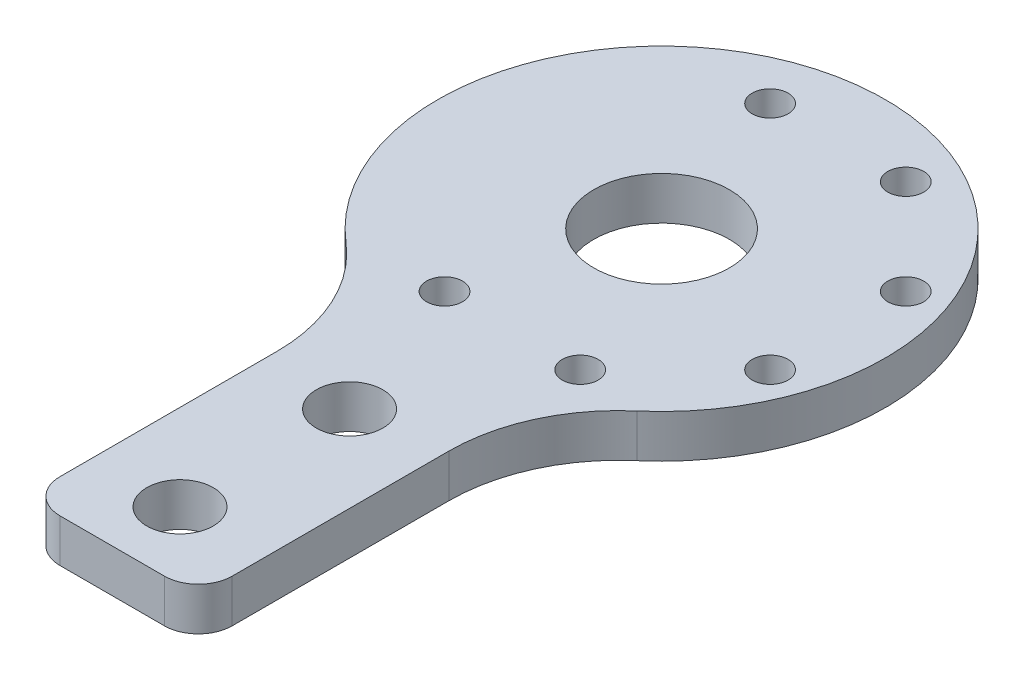
ISO-10303-21;
HEADER;
FILE_DESCRIPTION(('STEP AP214'),'2;1');
FILE_NAME('part.step','',(''),(''),'','','');
FILE_SCHEMA(('AUTOMOTIVE_DESIGN { 1 0 10303 214 1 1 1 1 }'));
ENDSEC;
DATA;
#1=APPLICATION_CONTEXT('core data for automotive mechanical design processes');
#2=APPLICATION_PROTOCOL_DEFINITION('international standard','automotive_design',2000,#1);
#3=PRODUCT_CONTEXT('',#1,'mechanical');
#4=PRODUCT('Part','Part','',(#3));
#5=PRODUCT_RELATED_PRODUCT_CATEGORY('part','',(#4));
#6=PRODUCT_DEFINITION_FORMATION('','',#4);
#7=PRODUCT_DEFINITION_CONTEXT('part definition',#1,'design');
#8=PRODUCT_DEFINITION('design','',#6,#7);
#9=PRODUCT_DEFINITION_SHAPE('','',#8);
#10=(LENGTH_UNIT() NAMED_UNIT(*) SI_UNIT(.MILLI.,.METRE.));
#11=(NAMED_UNIT(*) PLANE_ANGLE_UNIT() SI_UNIT($,.RADIAN.));
#12=(NAMED_UNIT(*) SI_UNIT($,.STERADIAN.) SOLID_ANGLE_UNIT());
#13=UNCERTAINTY_MEASURE_WITH_UNIT(LENGTH_MEASURE(1.E-05),#10,'distance_accuracy_value','');
#14=(GEOMETRIC_REPRESENTATION_CONTEXT(3) GLOBAL_UNCERTAINTY_ASSIGNED_CONTEXT((#13)) GLOBAL_UNIT_ASSIGNED_CONTEXT((#10,
#11,#12)) REPRESENTATION_CONTEXT('',''));
#15=CARTESIAN_POINT('',(0.,0.,0.));
#16=DIRECTION('',(0.,0.,1.));
#17=DIRECTION('',(1.,0.,0.));
#18=AXIS2_PLACEMENT_3D('',#15,#16,#17);
#19=CARTESIAN_POINT('',(12.7,6.35,81.));
#20=DIRECTION('',(-1.,0.,0.));
#21=DIRECTION('',(0.,0.,1.));
#22=AXIS2_PLACEMENT_3D('',#19,#20,#21);
#23=PLANE('',#22);
#24=DIRECTION('',(0.,0.,-1.));
#25=VECTOR('',#24,1.);
#26=CARTESIAN_POINT('',(12.7,6.35,81.));
#27=LINE('',#26,#25);
#28=CARTESIAN_POINT('',(12.7,6.35,76.));
#29=VERTEX_POINT('',#28);
#30=CARTESIAN_POINT('',(12.7,6.35,44.0761840453549));
#31=VERTEX_POINT('',#30);
#32=EDGE_CURVE('E227',#29,#31,#27,.T.);
#33=ORIENTED_EDGE('',*,*,#32,.F.);
#34=DIRECTION('',(0.,-1.,0.));
#35=VECTOR('',#34,1.);
#36=CARTESIAN_POINT('',(12.7,6.35,76.));
#37=LINE('',#36,#35);
#38=CARTESIAN_POINT('',(12.7,0.,76.));
#39=VERTEX_POINT('',#38);
#40=EDGE_CURVE('E11',#29,#39,#37,.T.);
#41=ORIENTED_EDGE('',*,*,#40,.T.);
#42=DIRECTION('',(0.,0.,-1.));
#43=VECTOR('',#42,1.);
#44=CARTESIAN_POINT('',(12.7,0.,81.));
#45=LINE('',#44,#43);
#46=CARTESIAN_POINT('',(12.7,0.,44.0761840453549));
#47=VERTEX_POINT('',#46);
#48=EDGE_CURVE('E236',#39,#47,#45,.T.);
#49=ORIENTED_EDGE('',*,*,#48,.T.);
#50=DIRECTION('',(0.,1.,0.));
#51=VECTOR('',#50,1.);
#52=CARTESIAN_POINT('',(12.7,6.35,44.0761840453549));
#53=LINE('',#52,#51);
#54=EDGE_CURVE('E131',#47,#31,#53,.T.);
#55=ORIENTED_EDGE('',*,*,#54,.T.);
#56=EDGE_LOOP('',(#33,#41,#49,#55));
#57=FACE_BOUND('',#56,.T.);
#58=ADVANCED_FACE('F43',(#57),#23,.F.);
#59=CARTESIAN_POINT('',(0.,6.35,0.));
#60=DIRECTION('',(0.,-1.,0.));
#61=DIRECTION('',(0.,0.,-1.));
#62=AXIS2_PLACEMENT_3D('',#59,#60,#61);
#63=CYLINDRICAL_SURFACE('',#62,33.);
#64=CARTESIAN_POINT('',(0.,0.,0.));
#65=DIRECTION('',(0.,1.,0.));
#66=DIRECTION('',(0.,0.,1.));
#67=AXIS2_PLACEMENT_3D('',#64,#65,#66);
#68=CIRCLE('',#67,33.);
#69=CARTESIAN_POINT('',(21.45,0.,25.0778288533916));
#70=VERTEX_POINT('',#69);
#71=CARTESIAN_POINT('',(-21.45,0.,25.0778288533916));
#72=VERTEX_POINT('',#71);
#73=EDGE_CURVE('E120',#70,#72,#68,.T.);
#74=ORIENTED_EDGE('',*,*,#73,.T.);
#75=DIRECTION('',(0.,-1.,0.));
#76=VECTOR('',#75,1.);
#77=CARTESIAN_POINT('',(-21.45,6.35,25.0778288533916));
#78=LINE('',#77,#76);
#79=CARTESIAN_POINT('',(-21.45,6.35,25.0778288533916));
#80=VERTEX_POINT('',#79);
#81=EDGE_CURVE('E128',#72,#80,#78,.F.);
#82=ORIENTED_EDGE('',*,*,#81,.T.);
#83=CARTESIAN_POINT('',(0.,6.35,0.));
#84=DIRECTION('',(0.,1.,0.));
#85=DIRECTION('',(0.,0.,1.));
#86=AXIS2_PLACEMENT_3D('',#83,#84,#85);
#87=CIRCLE('',#86,33.);
#88=CARTESIAN_POINT('',(21.45,6.35,25.0778288533916));
#89=VERTEX_POINT('',#88);
#90=EDGE_CURVE('E226',#89,#80,#87,.T.);
#91=ORIENTED_EDGE('',*,*,#90,.F.);
#92=DIRECTION('',(0.,-1.,0.));
#93=VECTOR('',#92,1.);
#94=CARTESIAN_POINT('',(21.45,6.35,25.0778288533916));
#95=LINE('',#94,#93);
#96=EDGE_CURVE('E137',#89,#70,#95,.T.);
#97=ORIENTED_EDGE('',*,*,#96,.T.);
#98=EDGE_LOOP('',(#74,#82,#91,#97));
#99=FACE_BOUND('',#98,.T.);
#100=ADVANCED_FACE('F199',(#99),#63,.T.);
#101=CARTESIAN_POINT('',(-12.7,6.35,81.));
#102=DIRECTION('',(-1.,0.,0.));
#103=DIRECTION('',(0.,0.,1.));
#104=AXIS2_PLACEMENT_3D('',#101,#102,#103);
#105=PLANE('',#104);
#106=DIRECTION('',(0.,0.,-1.));
#107=VECTOR('',#106,1.);
#108=CARTESIAN_POINT('',(-12.7,0.,81.));
#109=LINE('',#108,#107);
#110=CARTESIAN_POINT('',(-12.7,0.,76.));
#111=VERTEX_POINT('',#110);
#112=CARTESIAN_POINT('',(-12.7,0.,44.0761840453549));
#113=VERTEX_POINT('',#112);
#114=EDGE_CURVE('E109',#111,#113,#109,.T.);
#115=ORIENTED_EDGE('',*,*,#114,.F.);
#116=DIRECTION('',(0.,-1.,0.));
#117=VECTOR('',#116,1.);
#118=CARTESIAN_POINT('',(-12.7,6.35,76.));
#119=LINE('',#118,#117);
#120=CARTESIAN_POINT('',(-12.7,6.35,76.));
#121=VERTEX_POINT('',#120);
#122=EDGE_CURVE('E67',#111,#121,#119,.F.);
#123=ORIENTED_EDGE('',*,*,#122,.T.);
#124=DIRECTION('',(0.,0.,-1.));
#125=VECTOR('',#124,1.);
#126=CARTESIAN_POINT('',(-12.7,6.35,81.));
#127=LINE('',#126,#125);
#128=CARTESIAN_POINT('',(-12.7,6.35,44.0761840453549));
#129=VERTEX_POINT('',#128);
#130=EDGE_CURVE('E134',#121,#129,#127,.T.);
#131=ORIENTED_EDGE('',*,*,#130,.T.);
#132=DIRECTION('',(0.,-1.,0.));
#133=VECTOR('',#132,1.);
#134=CARTESIAN_POINT('',(-12.7,6.35,44.0761840453549));
#135=LINE('',#134,#133);
#136=EDGE_CURVE('E127',#129,#113,#135,.T.);
#137=ORIENTED_EDGE('',*,*,#136,.T.);
#138=EDGE_LOOP('',(#115,#123,#131,#137));
#139=FACE_BOUND('',#138,.T.);
#140=ADVANCED_FACE('F133',(#139),#105,.T.);
#141=CARTESIAN_POINT('',(-12.7,6.35,81.));
#142=DIRECTION('',(0.,0.,-1.));
#143=DIRECTION('',(-1.,0.,0.));
#144=AXIS2_PLACEMENT_3D('',#141,#142,#143);
#145=PLANE('',#144);
#146=DIRECTION('',(1.,0.,0.));
#147=VECTOR('',#146,1.);
#148=CARTESIAN_POINT('',(-12.7,6.35,81.));
#149=LINE('',#148,#147);
#150=CARTESIAN_POINT('',(-7.7,6.35,81.));
#151=VERTEX_POINT('',#150);
#152=CARTESIAN_POINT('',(7.7,6.35,81.));
#153=VERTEX_POINT('',#152);
#154=EDGE_CURVE('E138',#151,#153,#149,.T.);
#155=ORIENTED_EDGE('',*,*,#154,.F.);
#156=DIRECTION('',(0.,-1.,0.));
#157=VECTOR('',#156,1.);
#158=CARTESIAN_POINT('',(-7.7,0.,81.));
#159=LINE('',#158,#157);
#160=CARTESIAN_POINT('',(-7.7,0.,81.));
#161=VERTEX_POINT('',#160);
#162=EDGE_CURVE('E164',#151,#161,#159,.T.);
#163=ORIENTED_EDGE('',*,*,#162,.T.);
#164=DIRECTION('',(1.,0.,0.));
#165=VECTOR('',#164,1.);
#166=CARTESIAN_POINT('',(-12.7,0.,81.));
#167=LINE('',#166,#165);
#168=CARTESIAN_POINT('',(7.7,0.,81.));
#169=VERTEX_POINT('',#168);
#170=EDGE_CURVE('E119',#161,#169,#167,.T.);
#171=ORIENTED_EDGE('',*,*,#170,.T.);
#172=DIRECTION('',(0.,-1.,0.));
#173=VECTOR('',#172,1.);
#174=CARTESIAN_POINT('',(7.7,6.35,81.));
#175=LINE('',#174,#173);
#176=EDGE_CURVE('E161',#169,#153,#175,.F.);
#177=ORIENTED_EDGE('',*,*,#176,.T.);
#178=EDGE_LOOP('',(#155,#163,#171,#177));
#179=FACE_BOUND('',#178,.T.);
#180=ADVANCED_FACE('F183',(#179),#145,.F.);
#181=CARTESIAN_POINT('',(0.,6.35,0.));
#182=DIRECTION('',(0.,1.,0.));
#183=DIRECTION('',(0.,0.,1.));
#184=AXIS2_PLACEMENT_3D('',#181,#182,#183);
#185=PLANE('',#184);
#186=CARTESIAN_POINT('',(-8.,6.35,-24.));
#187=DIRECTION('',(0.,-1.,0.));
#188=DIRECTION('',(0.,0.,-1.));
#189=AXIS2_PLACEMENT_3D('',#186,#187,#188);
#190=CIRCLE('',#189,2.65);
#191=CARTESIAN_POINT('',(-8.,6.35,-26.65));
#192=VERTEX_POINT('',#191);
#193=EDGE_CURVE('E306',#192,#192,#190,.T.);
#194=ORIENTED_EDGE('',*,*,#193,.T.);
#195=EDGE_LOOP('',(#194));
#196=FACE_BOUND('',#195,.T.);
#197=CARTESIAN_POINT('',(12.,6.35,-24.));
#198=DIRECTION('',(0.,-1.,0.));
#199=DIRECTION('',(0.,0.,-1.));
#200=AXIS2_PLACEMENT_3D('',#197,#198,#199);
#201=CIRCLE('',#200,2.65);
#202=CARTESIAN_POINT('',(12.,6.35,-26.65));
#203=VERTEX_POINT('',#202);
#204=EDGE_CURVE('E298',#203,#203,#201,.T.);
#205=ORIENTED_EDGE('',*,*,#204,.T.);
#206=EDGE_LOOP('',(#205));
#207=FACE_BOUND('',#206,.T.);
#208=CARTESIAN_POINT('',(26.,6.35,-10.));
#209=DIRECTION('',(0.,-1.,0.));
#210=DIRECTION('',(0.,0.,-1.));
#211=AXIS2_PLACEMENT_3D('',#208,#209,#210);
#212=CIRCLE('',#211,2.65);
#213=CARTESIAN_POINT('',(26.,6.35,-12.65));
#214=VERTEX_POINT('',#213);
#215=EDGE_CURVE('E290',#214,#214,#212,.T.);
#216=ORIENTED_EDGE('',*,*,#215,.T.);
#217=EDGE_LOOP('',(#216));
#218=FACE_BOUND('',#217,.T.);
#219=CARTESIAN_POINT('',(26.,6.35,10.));
#220=DIRECTION('',(0.,-1.,0.));
#221=DIRECTION('',(0.,0.,-1.));
#222=AXIS2_PLACEMENT_3D('',#219,#220,#221);
#223=CIRCLE('',#222,2.65);
#224=CARTESIAN_POINT('',(26.,6.35,7.35));
#225=VERTEX_POINT('',#224);
#226=EDGE_CURVE('E282',#225,#225,#223,.T.);
#227=ORIENTED_EDGE('',*,*,#226,.T.);
#228=EDGE_LOOP('',(#227));
#229=FACE_BOUND('',#228,.T.);
#230=CARTESIAN_POINT('',(12.,6.35,24.));
#231=DIRECTION('',(0.,-1.,0.));
#232=DIRECTION('',(0.,0.,-1.));
#233=AXIS2_PLACEMENT_3D('',#230,#231,#232);
#234=CIRCLE('',#233,2.65);
#235=CARTESIAN_POINT('',(12.,6.35,21.35));
#236=VERTEX_POINT('',#235);
#237=EDGE_CURVE('E274',#236,#236,#234,.T.);
#238=ORIENTED_EDGE('',*,*,#237,.T.);
#239=EDGE_LOOP('',(#238));
#240=FACE_BOUND('',#239,.T.);
#241=CARTESIAN_POINT('',(-8.,6.35,24.));
#242=DIRECTION('',(0.,-1.,0.));
#243=DIRECTION('',(0.,0.,-1.));
#244=AXIS2_PLACEMENT_3D('',#241,#242,#243);
#245=CIRCLE('',#244,2.65);
#246=CARTESIAN_POINT('',(-8.,6.35,21.35));
#247=VERTEX_POINT('',#246);
#248=EDGE_CURVE('E266',#247,#247,#245,.T.);
#249=ORIENTED_EDGE('',*,*,#248,.T.);
#250=EDGE_LOOP('',(#249));
#251=FACE_BOUND('',#250,.T.);
#252=CARTESIAN_POINT('',(0.,6.35,46.));
#253=DIRECTION('',(0.,-1.,0.));
#254=DIRECTION('',(0.,0.,-1.));
#255=AXIS2_PLACEMENT_3D('',#252,#253,#254);
#256=CIRCLE('',#255,4.9022);
#257=CARTESIAN_POINT('',(0.,6.35,41.0978));
#258=VERTEX_POINT('',#257);
#259=EDGE_CURVE('E258',#258,#258,#256,.T.);
#260=ORIENTED_EDGE('',*,*,#259,.T.);
#261=EDGE_LOOP('',(#260));
#262=FACE_BOUND('',#261,.T.);
#263=CARTESIAN_POINT('',(0.,6.35,71.));
#264=DIRECTION('',(0.,-1.,0.));
#265=DIRECTION('',(0.,0.,-1.));
#266=AXIS2_PLACEMENT_3D('',#263,#264,#265);
#267=CIRCLE('',#266,4.9022);
#268=CARTESIAN_POINT('',(0.,6.35,66.0978));
#269=VERTEX_POINT('',#268);
#270=EDGE_CURVE('E251',#269,#269,#267,.T.);
#271=ORIENTED_EDGE('',*,*,#270,.T.);
#272=EDGE_LOOP('',(#271));
#273=FACE_BOUND('',#272,.T.);
#274=CARTESIAN_POINT('',(0.,6.35,0.));
#275=DIRECTION('',(0.,-1.,0.));
#276=DIRECTION('',(0.,0.,-1.));
#277=AXIS2_PLACEMENT_3D('',#274,#275,#276);
#278=CIRCLE('',#277,10.);
#279=CARTESIAN_POINT('',(0.,6.35,-10.));
#280=VERTEX_POINT('',#279);
#281=EDGE_CURVE('E239',#280,#280,#278,.T.);
#282=ORIENTED_EDGE('',*,*,#281,.T.);
#283=EDGE_LOOP('',(#282));
#284=FACE_BOUND('',#283,.T.);
#285=ORIENTED_EDGE('',*,*,#130,.F.);
#286=CARTESIAN_POINT('',(-7.7,6.35,76.));
#287=DIRECTION('',(0.,1.,0.));
#288=DIRECTION('',(0.,0.,1.));
#289=AXIS2_PLACEMENT_3D('',#286,#287,#288);
#290=CIRCLE('',#289,5.);
#291=EDGE_CURVE('E52',#121,#151,#290,.T.);
#292=ORIENTED_EDGE('',*,*,#291,.T.);
#293=ORIENTED_EDGE('',*,*,#154,.T.);
#294=CARTESIAN_POINT('',(7.7,6.35,76.));
#295=DIRECTION('',(0.,1.,0.));
#296=DIRECTION('',(0.,0.,1.));
#297=AXIS2_PLACEMENT_3D('',#294,#295,#296);
#298=CIRCLE('',#297,5.);
#299=EDGE_CURVE('E59',#153,#29,#298,.T.);
#300=ORIENTED_EDGE('',*,*,#299,.T.);
#301=ORIENTED_EDGE('',*,*,#32,.T.);
#302=CARTESIAN_POINT('',(37.7,6.35,44.0761840453549));
#303=DIRECTION('',(0.,1.,0.));
#304=DIRECTION('',(0.,0.,1.));
#305=AXIS2_PLACEMENT_3D('',#302,#303,#304);
#306=CIRCLE('',#305,25.);
#307=EDGE_CURVE('E158',#31,#89,#306,.F.);
#308=ORIENTED_EDGE('',*,*,#307,.T.);
#309=ORIENTED_EDGE('',*,*,#90,.T.);
#310=CARTESIAN_POINT('',(-37.7,6.35,44.0761840453549));
#311=DIRECTION('',(0.,1.,0.));
#312=DIRECTION('',(0.,0.,1.));
#313=AXIS2_PLACEMENT_3D('',#310,#311,#312);
#314=CIRCLE('',#313,25.);
#315=EDGE_CURVE('E130',#80,#129,#314,.F.);
#316=ORIENTED_EDGE('',*,*,#315,.T.);
#317=EDGE_LOOP('',(#285,#292,#293,#300,#301,#308,#309,#316));
#318=FACE_BOUND('',#317,.T.);
#319=ADVANCED_FACE('F179',(#196,#207,#218,#229,#240,#251,#262,#273,#284,#318),#185,.T.);
#320=CARTESIAN_POINT('',(0.,0.,0.));
#321=DIRECTION('',(0.,1.,0.));
#322=DIRECTION('',(0.,0.,1.));
#323=AXIS2_PLACEMENT_3D('',#320,#321,#322);
#324=PLANE('',#323);
#325=CARTESIAN_POINT('',(-8.,0.,-24.));
#326=DIRECTION('',(0.,-1.,0.));
#327=DIRECTION('',(0.,0.,-1.));
#328=AXIS2_PLACEMENT_3D('',#325,#326,#327);
#329=CIRCLE('',#328,2.64999999999999);
#330=CARTESIAN_POINT('',(-8.,0.,-26.65));
#331=VERTEX_POINT('',#330);
#332=EDGE_CURVE('E310',#331,#331,#329,.T.);
#333=ORIENTED_EDGE('',*,*,#332,.F.);
#334=EDGE_LOOP('',(#333));
#335=FACE_BOUND('',#334,.T.);
#336=CARTESIAN_POINT('',(12.,0.,-24.));
#337=DIRECTION('',(0.,-1.,0.));
#338=DIRECTION('',(0.,0.,-1.));
#339=AXIS2_PLACEMENT_3D('',#336,#337,#338);
#340=CIRCLE('',#339,2.64999999999999);
#341=CARTESIAN_POINT('',(12.,0.,-26.65));
#342=VERTEX_POINT('',#341);
#343=EDGE_CURVE('E302',#342,#342,#340,.T.);
#344=ORIENTED_EDGE('',*,*,#343,.F.);
#345=EDGE_LOOP('',(#344));
#346=FACE_BOUND('',#345,.T.);
#347=CARTESIAN_POINT('',(26.,0.,-10.));
#348=DIRECTION('',(0.,-1.,0.));
#349=DIRECTION('',(0.,0.,-1.));
#350=AXIS2_PLACEMENT_3D('',#347,#348,#349);
#351=CIRCLE('',#350,2.64999999999999);
#352=CARTESIAN_POINT('',(26.,0.,-12.65));
#353=VERTEX_POINT('',#352);
#354=EDGE_CURVE('E294',#353,#353,#351,.T.);
#355=ORIENTED_EDGE('',*,*,#354,.F.);
#356=EDGE_LOOP('',(#355));
#357=FACE_BOUND('',#356,.T.);
#358=CARTESIAN_POINT('',(26.,0.,10.));
#359=DIRECTION('',(0.,-1.,0.));
#360=DIRECTION('',(0.,0.,-1.));
#361=AXIS2_PLACEMENT_3D('',#358,#359,#360);
#362=CIRCLE('',#361,2.64999999999999);
#363=CARTESIAN_POINT('',(26.,0.,7.35000000000001));
#364=VERTEX_POINT('',#363);
#365=EDGE_CURVE('E286',#364,#364,#362,.T.);
#366=ORIENTED_EDGE('',*,*,#365,.F.);
#367=EDGE_LOOP('',(#366));
#368=FACE_BOUND('',#367,.T.);
#369=CARTESIAN_POINT('',(12.,0.,24.));
#370=DIRECTION('',(0.,-1.,0.));
#371=DIRECTION('',(0.,0.,-1.));
#372=AXIS2_PLACEMENT_3D('',#369,#370,#371);
#373=CIRCLE('',#372,2.64999999999999);
#374=CARTESIAN_POINT('',(12.,0.,21.35));
#375=VERTEX_POINT('',#374);
#376=EDGE_CURVE('E278',#375,#375,#373,.T.);
#377=ORIENTED_EDGE('',*,*,#376,.F.);
#378=EDGE_LOOP('',(#377));
#379=FACE_BOUND('',#378,.T.);
#380=CARTESIAN_POINT('',(-8.,0.,24.));
#381=DIRECTION('',(0.,-1.,0.));
#382=DIRECTION('',(0.,0.,-1.));
#383=AXIS2_PLACEMENT_3D('',#380,#381,#382);
#384=CIRCLE('',#383,2.64999999999999);
#385=CARTESIAN_POINT('',(-8.,0.,21.35));
#386=VERTEX_POINT('',#385);
#387=EDGE_CURVE('E270',#386,#386,#384,.T.);
#388=ORIENTED_EDGE('',*,*,#387,.F.);
#389=EDGE_LOOP('',(#388));
#390=FACE_BOUND('',#389,.T.);
#391=CARTESIAN_POINT('',(0.,0.,46.));
#392=DIRECTION('',(0.,-1.,0.));
#393=DIRECTION('',(0.,0.,-1.));
#394=AXIS2_PLACEMENT_3D('',#391,#392,#393);
#395=CIRCLE('',#394,4.9022);
#396=CARTESIAN_POINT('',(0.,0.,41.0978));
#397=VERTEX_POINT('',#396);
#398=EDGE_CURVE('E262',#397,#397,#395,.T.);
#399=ORIENTED_EDGE('',*,*,#398,.F.);
#400=EDGE_LOOP('',(#399));
#401=FACE_BOUND('',#400,.T.);
#402=CARTESIAN_POINT('',(0.,0.,71.));
#403=DIRECTION('',(0.,-1.,0.));
#404=DIRECTION('',(0.,0.,-1.));
#405=AXIS2_PLACEMENT_3D('',#402,#403,#404);
#406=CIRCLE('',#405,4.9022);
#407=CARTESIAN_POINT('',(0.,0.,66.0978));
#408=VERTEX_POINT('',#407);
#409=EDGE_CURVE('E254',#408,#408,#406,.T.);
#410=ORIENTED_EDGE('',*,*,#409,.F.);
#411=EDGE_LOOP('',(#410));
#412=FACE_BOUND('',#411,.T.);
#413=CARTESIAN_POINT('',(0.,0.,0.));
#414=DIRECTION('',(0.,-1.,0.));
#415=DIRECTION('',(0.,0.,-1.));
#416=AXIS2_PLACEMENT_3D('',#413,#414,#415);
#417=CIRCLE('',#416,10.);
#418=CARTESIAN_POINT('',(0.,0.,-10.));
#419=VERTEX_POINT('',#418);
#420=EDGE_CURVE('E247',#419,#419,#417,.T.);
#421=ORIENTED_EDGE('',*,*,#420,.F.);
#422=EDGE_LOOP('',(#421));
#423=FACE_BOUND('',#422,.T.);
#424=ORIENTED_EDGE('',*,*,#170,.F.);
#425=CARTESIAN_POINT('',(-7.7,0.,76.));
#426=DIRECTION('',(0.,1.,0.));
#427=DIRECTION('',(0.,0.,1.));
#428=AXIS2_PLACEMENT_3D('',#425,#426,#427);
#429=CIRCLE('',#428,5.);
#430=EDGE_CURVE('E116',#161,#111,#429,.F.);
#431=ORIENTED_EDGE('',*,*,#430,.T.);
#432=ORIENTED_EDGE('',*,*,#114,.T.);
#433=CARTESIAN_POINT('',(-37.7,0.,44.0761840453549));
#434=DIRECTION('',(0.,1.,0.));
#435=DIRECTION('',(0.,0.,1.));
#436=AXIS2_PLACEMENT_3D('',#433,#434,#435);
#437=CIRCLE('',#436,25.);
#438=EDGE_CURVE('E114',#113,#72,#437,.T.);
#439=ORIENTED_EDGE('',*,*,#438,.T.);
#440=ORIENTED_EDGE('',*,*,#73,.F.);
#441=CARTESIAN_POINT('',(37.7,0.,44.0761840453549));
#442=DIRECTION('',(0.,1.,0.));
#443=DIRECTION('',(0.,0.,1.));
#444=AXIS2_PLACEMENT_3D('',#441,#442,#443);
#445=CIRCLE('',#444,25.);
#446=EDGE_CURVE('E154',#70,#47,#445,.T.);
#447=ORIENTED_EDGE('',*,*,#446,.T.);
#448=ORIENTED_EDGE('',*,*,#48,.F.);
#449=CARTESIAN_POINT('',(7.7,0.,76.));
#450=DIRECTION('',(0.,1.,0.));
#451=DIRECTION('',(0.,0.,1.));
#452=AXIS2_PLACEMENT_3D('',#449,#450,#451);
#453=CIRCLE('',#452,5.);
#454=EDGE_CURVE('E168',#39,#169,#453,.F.);
#455=ORIENTED_EDGE('',*,*,#454,.T.);
#456=EDGE_LOOP('',(#424,#431,#432,#439,#440,#447,#448,#455));
#457=FACE_BOUND('',#456,.T.);
#458=ADVANCED_FACE('F112',(#335,#346,#357,#368,#379,#390,#401,#412,#423,#457),#324,.F.);
#459=CARTESIAN_POINT('',(0.,6.35,0.));
#460=DIRECTION('',(0.,-1.,0.));
#461=DIRECTION('',(0.,0.,-1.));
#462=AXIS2_PLACEMENT_3D('',#459,#460,#461);
#463=CYLINDRICAL_SURFACE('',#462,10.);
#464=ORIENTED_EDGE('',*,*,#281,.F.);
#465=EDGE_LOOP('',(#464));
#466=FACE_BOUND('',#465,.T.);
#467=ORIENTED_EDGE('',*,*,#420,.T.);
#468=EDGE_LOOP('',(#467));
#469=FACE_BOUND('',#468,.T.);
#470=ADVANCED_FACE('F319',(#466,#469),#463,.F.);
#471=CARTESIAN_POINT('',(0.,0.,71.));
#472=DIRECTION('',(0.,-1.,0.));
#473=DIRECTION('',(0.,0.,-1.));
#474=AXIS2_PLACEMENT_3D('',#471,#472,#473);
#475=CYLINDRICAL_SURFACE('',#474,4.9022);
#476=ORIENTED_EDGE('',*,*,#270,.F.);
#477=EDGE_LOOP('',(#476));
#478=FACE_BOUND('',#477,.T.);
#479=ORIENTED_EDGE('',*,*,#409,.T.);
#480=EDGE_LOOP('',(#479));
#481=FACE_BOUND('',#480,.T.);
#482=ADVANCED_FACE('F338',(#478,#481),#475,.F.);
#483=CARTESIAN_POINT('',(0.,0.,46.));
#484=DIRECTION('',(0.,-1.,0.));
#485=DIRECTION('',(0.,0.,-1.));
#486=AXIS2_PLACEMENT_3D('',#483,#484,#485);
#487=CYLINDRICAL_SURFACE('',#486,4.9022);
#488=ORIENTED_EDGE('',*,*,#259,.F.);
#489=EDGE_LOOP('',(#488));
#490=FACE_BOUND('',#489,.T.);
#491=ORIENTED_EDGE('',*,*,#398,.T.);
#492=EDGE_LOOP('',(#491));
#493=FACE_BOUND('',#492,.T.);
#494=ADVANCED_FACE('F211',(#490,#493),#487,.F.);
#495=CARTESIAN_POINT('',(-37.7,6.35,44.0761840453549));
#496=DIRECTION('',(0.,-1.,0.));
#497=DIRECTION('',(0.,0.,-1.));
#498=AXIS2_PLACEMENT_3D('',#495,#496,#497);
#499=CYLINDRICAL_SURFACE('',#498,25.);
#500=ORIENTED_EDGE('',*,*,#315,.F.);
#501=ORIENTED_EDGE('',*,*,#81,.F.);
#502=ORIENTED_EDGE('',*,*,#438,.F.);
#503=ORIENTED_EDGE('',*,*,#136,.F.);
#504=EDGE_LOOP('',(#500,#501,#502,#503));
#505=FACE_BOUND('',#504,.T.);
#506=ADVANCED_FACE('F126',(#505),#499,.F.);
#507=CARTESIAN_POINT('',(37.7,6.35,44.0761840453549));
#508=DIRECTION('',(0.,-1.,0.));
#509=DIRECTION('',(0.,0.,-1.));
#510=AXIS2_PLACEMENT_3D('',#507,#508,#509);
#511=CYLINDRICAL_SURFACE('',#510,25.);
#512=ORIENTED_EDGE('',*,*,#307,.F.);
#513=ORIENTED_EDGE('',*,*,#54,.F.);
#514=ORIENTED_EDGE('',*,*,#446,.F.);
#515=ORIENTED_EDGE('',*,*,#96,.F.);
#516=EDGE_LOOP('',(#512,#513,#514,#515));
#517=FACE_BOUND('',#516,.T.);
#518=ADVANCED_FACE('F210',(#517),#511,.F.);
#519=CARTESIAN_POINT('',(-8.,0.,24.));
#520=DIRECTION('',(0.,-1.,0.));
#521=DIRECTION('',(0.,0.,-1.));
#522=AXIS2_PLACEMENT_3D('',#519,#520,#521);
#523=CYLINDRICAL_SURFACE('',#522,2.64999999999999);
#524=ORIENTED_EDGE('',*,*,#248,.F.);
#525=EDGE_LOOP('',(#524));
#526=FACE_BOUND('',#525,.T.);
#527=ORIENTED_EDGE('',*,*,#387,.T.);
#528=EDGE_LOOP('',(#527));
#529=FACE_BOUND('',#528,.T.);
#530=ADVANCED_FACE('F213',(#526,#529),#523,.F.);
#531=CARTESIAN_POINT('',(12.,0.,24.));
#532=DIRECTION('',(0.,-1.,0.));
#533=DIRECTION('',(0.,0.,-1.));
#534=AXIS2_PLACEMENT_3D('',#531,#532,#533);
#535=CYLINDRICAL_SURFACE('',#534,2.64999999999999);
#536=ORIENTED_EDGE('',*,*,#237,.F.);
#537=EDGE_LOOP('',(#536));
#538=FACE_BOUND('',#537,.T.);
#539=ORIENTED_EDGE('',*,*,#376,.T.);
#540=EDGE_LOOP('',(#539));
#541=FACE_BOUND('',#540,.T.);
#542=ADVANCED_FACE('F218',(#538,#541),#535,.F.);
#543=CARTESIAN_POINT('',(26.,0.,10.));
#544=DIRECTION('',(0.,-1.,0.));
#545=DIRECTION('',(0.,0.,-1.));
#546=AXIS2_PLACEMENT_3D('',#543,#544,#545);
#547=CYLINDRICAL_SURFACE('',#546,2.64999999999999);
#548=ORIENTED_EDGE('',*,*,#226,.F.);
#549=EDGE_LOOP('',(#548));
#550=FACE_BOUND('',#549,.T.);
#551=ORIENTED_EDGE('',*,*,#365,.T.);
#552=EDGE_LOOP('',(#551));
#553=FACE_BOUND('',#552,.T.);
#554=ADVANCED_FACE('F411',(#550,#553),#547,.F.);
#555=CARTESIAN_POINT('',(26.,0.,-10.));
#556=DIRECTION('',(0.,-1.,0.));
#557=DIRECTION('',(0.,0.,-1.));
#558=AXIS2_PLACEMENT_3D('',#555,#556,#557);
#559=CYLINDRICAL_SURFACE('',#558,2.64999999999999);
#560=ORIENTED_EDGE('',*,*,#215,.F.);
#561=EDGE_LOOP('',(#560));
#562=FACE_BOUND('',#561,.T.);
#563=ORIENTED_EDGE('',*,*,#354,.T.);
#564=EDGE_LOOP('',(#563));
#565=FACE_BOUND('',#564,.T.);
#566=ADVANCED_FACE('F401',(#562,#565),#559,.F.);
#567=CARTESIAN_POINT('',(12.,0.,-24.));
#568=DIRECTION('',(0.,-1.,0.));
#569=DIRECTION('',(0.,0.,-1.));
#570=AXIS2_PLACEMENT_3D('',#567,#568,#569);
#571=CYLINDRICAL_SURFACE('',#570,2.64999999999999);
#572=ORIENTED_EDGE('',*,*,#204,.F.);
#573=EDGE_LOOP('',(#572));
#574=FACE_BOUND('',#573,.T.);
#575=ORIENTED_EDGE('',*,*,#343,.T.);
#576=EDGE_LOOP('',(#575));
#577=FACE_BOUND('',#576,.T.);
#578=ADVANCED_FACE('F194',(#574,#577),#571,.F.);
#579=CARTESIAN_POINT('',(-8.,0.,-24.));
#580=DIRECTION('',(0.,-1.,0.));
#581=DIRECTION('',(0.,0.,-1.));
#582=AXIS2_PLACEMENT_3D('',#579,#580,#581);
#583=CYLINDRICAL_SURFACE('',#582,2.64999999999999);
#584=ORIENTED_EDGE('',*,*,#193,.F.);
#585=EDGE_LOOP('',(#584));
#586=FACE_BOUND('',#585,.T.);
#587=ORIENTED_EDGE('',*,*,#332,.T.);
#588=EDGE_LOOP('',(#587));
#589=FACE_BOUND('',#588,.T.);
#590=ADVANCED_FACE('F188',(#586,#589),#583,.F.);
#591=CARTESIAN_POINT('',(-7.7,6.35,76.));
#592=DIRECTION('',(0.,1.,0.));
#593=DIRECTION('',(0.,0.,1.));
#594=AXIS2_PLACEMENT_3D('',#591,#592,#593);
#595=CYLINDRICAL_SURFACE('',#594,5.);
#596=ORIENTED_EDGE('',*,*,#291,.F.);
#597=ORIENTED_EDGE('',*,*,#122,.F.);
#598=ORIENTED_EDGE('',*,*,#430,.F.);
#599=ORIENTED_EDGE('',*,*,#162,.F.);
#600=EDGE_LOOP('',(#596,#597,#598,#599));
#601=FACE_BOUND('',#600,.T.);
#602=ADVANCED_FACE('F186',(#601),#595,.T.);
#603=CARTESIAN_POINT('',(7.7,6.35,76.));
#604=DIRECTION('',(0.,-1.,0.));
#605=DIRECTION('',(0.,0.,-1.));
#606=AXIS2_PLACEMENT_3D('',#603,#604,#605);
#607=CYLINDRICAL_SURFACE('',#606,5.);
#608=ORIENTED_EDGE('',*,*,#299,.F.);
#609=ORIENTED_EDGE('',*,*,#176,.F.);
#610=ORIENTED_EDGE('',*,*,#454,.F.);
#611=ORIENTED_EDGE('',*,*,#40,.F.);
#612=EDGE_LOOP('',(#608,#609,#610,#611));
#613=FACE_BOUND('',#612,.T.);
#614=ADVANCED_FACE('F45',(#613),#607,.T.);
#615=CLOSED_SHELL('',(#58,#100,#140,#180,#319,#458,#470,#482,#494,#506,#518,#530,#542,#554,#566,
#578,#590,#602,#614));
#616=MANIFOLD_SOLID_BREP('B2',#615);
#617=ADVANCED_BREP_SHAPE_REPRESENTATION('',(#18,#616),#14);
#618=SHAPE_DEFINITION_REPRESENTATION(#9,#617);
ENDSEC;
END-ISO-10303-21;
